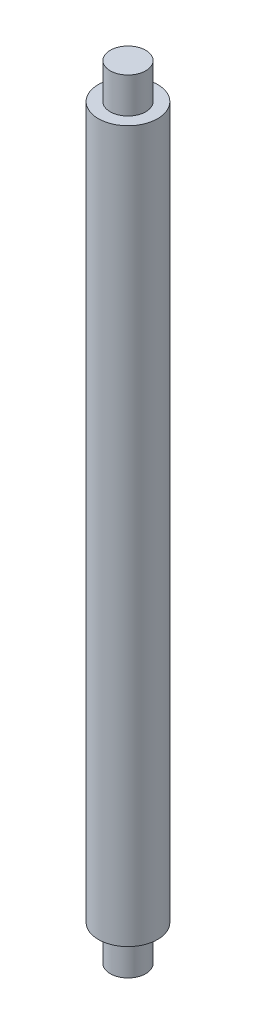
ISO-10303-21;
HEADER;
FILE_DESCRIPTION(('STEP AP214'),'2;1');
FILE_NAME('part.step','',(''),(''),'','','');
FILE_SCHEMA(('AUTOMOTIVE_DESIGN { 1 0 10303 214 1 1 1 1 }'));
ENDSEC;
DATA;
#1=APPLICATION_CONTEXT('core data for automotive mechanical design processes');
#2=APPLICATION_PROTOCOL_DEFINITION('international standard','automotive_design',2000,#1);
#3=PRODUCT_CONTEXT('',#1,'mechanical');
#4=PRODUCT('Part','Part','',(#3));
#5=PRODUCT_RELATED_PRODUCT_CATEGORY('part','',(#4));
#6=PRODUCT_DEFINITION_FORMATION('','',#4);
#7=PRODUCT_DEFINITION_CONTEXT('part definition',#1,'design');
#8=PRODUCT_DEFINITION('design','',#6,#7);
#9=PRODUCT_DEFINITION_SHAPE('','',#8);
#10=(LENGTH_UNIT() NAMED_UNIT(*) SI_UNIT(.MILLI.,.METRE.));
#11=(NAMED_UNIT(*) PLANE_ANGLE_UNIT() SI_UNIT($,.RADIAN.));
#12=(NAMED_UNIT(*) SI_UNIT($,.STERADIAN.) SOLID_ANGLE_UNIT());
#13=UNCERTAINTY_MEASURE_WITH_UNIT(LENGTH_MEASURE(1.E-05),#10,'distance_accuracy_value','');
#14=(GEOMETRIC_REPRESENTATION_CONTEXT(3) GLOBAL_UNCERTAINTY_ASSIGNED_CONTEXT((#13)) GLOBAL_UNIT_ASSIGNED_CONTEXT((#10,
#11,#12)) REPRESENTATION_CONTEXT('',''));
#15=CARTESIAN_POINT('',(0.,0.,0.));
#16=DIRECTION('',(0.,0.,1.));
#17=DIRECTION('',(1.,0.,0.));
#18=AXIS2_PLACEMENT_3D('',#15,#16,#17);
#19=CARTESIAN_POINT('',(0.,-30.,0.));
#20=DIRECTION('',(0.,1.,0.));
#21=DIRECTION('',(0.,0.,1.));
#22=AXIS2_PLACEMENT_3D('',#19,#20,#21);
#23=CYLINDRICAL_SURFACE('',#22,2.5);
#24=CARTESIAN_POINT('',(0.,-30.,0.));
#25=DIRECTION('',(0.,1.,0.));
#26=DIRECTION('',(0.,0.,1.));
#27=AXIS2_PLACEMENT_3D('',#24,#25,#26);
#28=CIRCLE('',#27,2.5);
#29=CARTESIAN_POINT('',(0.,-30.,2.5));
#30=VERTEX_POINT('',#29);
#31=EDGE_CURVE('E51',#30,#30,#28,.T.);
#32=ORIENTED_EDGE('',*,*,#31,.T.);
#33=EDGE_LOOP('',(#32));
#34=FACE_BOUND('',#33,.T.);
#35=CARTESIAN_POINT('',(0.,30.,0.));
#36=DIRECTION('',(0.,1.,0.));
#37=DIRECTION('',(0.,0.,1.));
#38=AXIS2_PLACEMENT_3D('',#35,#36,#37);
#39=CIRCLE('',#38,2.5);
#40=CARTESIAN_POINT('',(0.,30.,2.5));
#41=VERTEX_POINT('',#40);
#42=EDGE_CURVE('E42',#41,#41,#39,.T.);
#43=ORIENTED_EDGE('',*,*,#42,.F.);
#44=EDGE_LOOP('',(#43));
#45=FACE_BOUND('',#44,.T.);
#46=ADVANCED_FACE('F39',(#34,#45),#23,.T.);
#47=CARTESIAN_POINT('',(0.,-30.,0.));
#48=DIRECTION('',(0.,1.,0.));
#49=DIRECTION('',(0.,0.,1.));
#50=AXIS2_PLACEMENT_3D('',#47,#48,#49);
#51=PLANE('',#50);
#52=CARTESIAN_POINT('',(0.,-30.,0.));
#53=DIRECTION('',(0.,-1.,0.));
#54=DIRECTION('',(0.,0.,-1.));
#55=AXIS2_PLACEMENT_3D('',#52,#53,#54);
#56=CIRCLE('',#55,1.5);
#57=CARTESIAN_POINT('',(0.,-30.,-1.5));
#58=VERTEX_POINT('',#57);
#59=EDGE_CURVE('E10',#58,#58,#56,.T.);
#60=ORIENTED_EDGE('',*,*,#59,.F.);
#61=EDGE_LOOP('',(#60));
#62=FACE_BOUND('',#61,.T.);
#63=ORIENTED_EDGE('',*,*,#31,.F.);
#64=EDGE_LOOP('',(#63));
#65=FACE_BOUND('',#64,.T.);
#66=ADVANCED_FACE('F67',(#62,#65),#51,.F.);
#67=CARTESIAN_POINT('',(0.,30.,0.));
#68=DIRECTION('',(0.,1.,0.));
#69=DIRECTION('',(0.,0.,1.));
#70=AXIS2_PLACEMENT_3D('',#67,#68,#69);
#71=PLANE('',#70);
#72=CARTESIAN_POINT('',(0.,30.,0.));
#73=DIRECTION('',(0.,1.,0.));
#74=DIRECTION('',(0.,0.,1.));
#75=AXIS2_PLACEMENT_3D('',#72,#73,#74);
#76=CIRCLE('',#75,1.5);
#77=CARTESIAN_POINT('',(0.,30.,1.5));
#78=VERTEX_POINT('',#77);
#79=EDGE_CURVE('E46',#78,#78,#76,.T.);
#80=ORIENTED_EDGE('',*,*,#79,.F.);
#81=EDGE_LOOP('',(#80));
#82=FACE_BOUND('',#81,.T.);
#83=ORIENTED_EDGE('',*,*,#42,.T.);
#84=EDGE_LOOP('',(#83));
#85=FACE_BOUND('',#84,.T.);
#86=ADVANCED_FACE('F64',(#82,#85),#71,.T.);
#87=CARTESIAN_POINT('',(0.,33.,0.));
#88=DIRECTION('',(0.,-1.,0.));
#89=DIRECTION('',(0.,0.,-1.));
#90=AXIS2_PLACEMENT_3D('',#87,#88,#89);
#91=CYLINDRICAL_SURFACE('',#90,1.5);
#92=CARTESIAN_POINT('',(0.,33.,0.));
#93=DIRECTION('',(0.,1.,0.));
#94=DIRECTION('',(0.,0.,1.));
#95=AXIS2_PLACEMENT_3D('',#92,#93,#94);
#96=CIRCLE('',#95,1.5);
#97=CARTESIAN_POINT('',(0.,33.,1.5));
#98=VERTEX_POINT('',#97);
#99=EDGE_CURVE('E56',#98,#98,#96,.T.);
#100=ORIENTED_EDGE('',*,*,#99,.F.);
#101=EDGE_LOOP('',(#100));
#102=FACE_BOUND('',#101,.T.);
#103=ORIENTED_EDGE('',*,*,#79,.T.);
#104=EDGE_LOOP('',(#103));
#105=FACE_BOUND('',#104,.T.);
#106=ADVANCED_FACE('F76',(#102,#105),#91,.T.);
#107=CARTESIAN_POINT('',(0.,33.,0.));
#108=DIRECTION('',(0.,1.,0.));
#109=DIRECTION('',(0.,0.,1.));
#110=AXIS2_PLACEMENT_3D('',#107,#108,#109);
#111=PLANE('',#110);
#112=ORIENTED_EDGE('',*,*,#99,.T.);
#113=EDGE_LOOP('',(#112));
#114=FACE_BOUND('',#113,.T.);
#115=ADVANCED_FACE('F82',(#114),#111,.T.);
#116=CARTESIAN_POINT('',(0.,-33.,0.));
#117=DIRECTION('',(0.,1.,0.));
#118=DIRECTION('',(0.,0.,1.));
#119=AXIS2_PLACEMENT_3D('',#116,#117,#118);
#120=CYLINDRICAL_SURFACE('',#119,1.5);
#121=CARTESIAN_POINT('',(0.,-33.,0.));
#122=DIRECTION('',(0.,-1.,0.));
#123=DIRECTION('',(0.,0.,-1.));
#124=AXIS2_PLACEMENT_3D('',#121,#122,#123);
#125=CIRCLE('',#124,1.5);
#126=CARTESIAN_POINT('',(0.,-33.,-1.5));
#127=VERTEX_POINT('',#126);
#128=EDGE_CURVE('E55',#127,#127,#125,.T.);
#129=ORIENTED_EDGE('',*,*,#128,.F.);
#130=EDGE_LOOP('',(#129));
#131=FACE_BOUND('',#130,.T.);
#132=ORIENTED_EDGE('',*,*,#59,.T.);
#133=EDGE_LOOP('',(#132));
#134=FACE_BOUND('',#133,.T.);
#135=ADVANCED_FACE('F86',(#131,#134),#120,.T.);
#136=CARTESIAN_POINT('',(0.,-33.,0.));
#137=DIRECTION('',(0.,-1.,0.));
#138=DIRECTION('',(0.,0.,-1.));
#139=AXIS2_PLACEMENT_3D('',#136,#137,#138);
#140=PLANE('',#139);
#141=ORIENTED_EDGE('',*,*,#128,.T.);
#142=EDGE_LOOP('',(#141));
#143=FACE_BOUND('',#142,.T.);
#144=ADVANCED_FACE('F90',(#143),#140,.T.);
#145=CLOSED_SHELL('',(#46,#66,#86,#106,#115,#135,#144));
#146=MANIFOLD_SOLID_BREP('B2',#145);
#147=ADVANCED_BREP_SHAPE_REPRESENTATION('',(#18,#146),#14);
#148=SHAPE_DEFINITION_REPRESENTATION(#9,#147);
ENDSEC;
END-ISO-10303-21;
